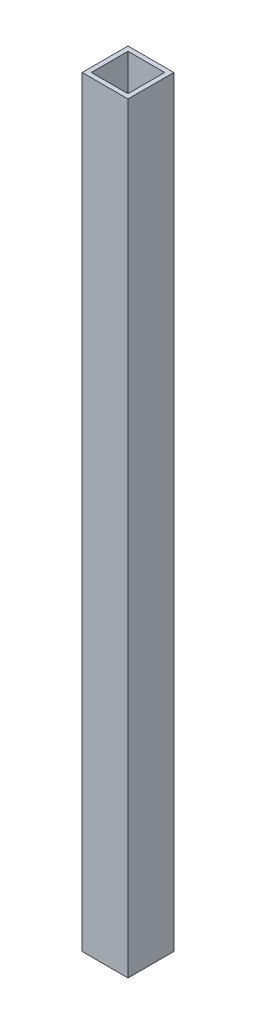
ISO-10303-21;
HEADER;
FILE_DESCRIPTION(('STEP AP214'),'2;1');
FILE_NAME('part.step','',(''),(''),'','','');
FILE_SCHEMA(('AUTOMOTIVE_DESIGN { 1 0 10303 214 1 1 1 1 }'));
ENDSEC;
DATA;
#1=APPLICATION_CONTEXT('core data for automotive mechanical design processes');
#2=APPLICATION_PROTOCOL_DEFINITION('international standard','automotive_design',2000,#1);
#3=PRODUCT_CONTEXT('',#1,'mechanical');
#4=PRODUCT('Part','Part','',(#3));
#5=PRODUCT_RELATED_PRODUCT_CATEGORY('part','',(#4));
#6=PRODUCT_DEFINITION_FORMATION('','',#4);
#7=PRODUCT_DEFINITION_CONTEXT('part definition',#1,'design');
#8=PRODUCT_DEFINITION('design','',#6,#7);
#9=PRODUCT_DEFINITION_SHAPE('','',#8);
#10=(LENGTH_UNIT() NAMED_UNIT(*) SI_UNIT(.MILLI.,.METRE.));
#11=(NAMED_UNIT(*) PLANE_ANGLE_UNIT() SI_UNIT($,.RADIAN.));
#12=(NAMED_UNIT(*) SI_UNIT($,.STERADIAN.) SOLID_ANGLE_UNIT());
#13=UNCERTAINTY_MEASURE_WITH_UNIT(LENGTH_MEASURE(1.E-05),#10,'distance_accuracy_value','');
#14=(GEOMETRIC_REPRESENTATION_CONTEXT(3) GLOBAL_UNCERTAINTY_ASSIGNED_CONTEXT((#13)) GLOBAL_UNIT_ASSIGNED_CONTEXT((#10,
#11,#12)) REPRESENTATION_CONTEXT('',''));
#15=CARTESIAN_POINT('',(0.,0.,0.));
#16=DIRECTION('',(0.,0.,1.));
#17=DIRECTION('',(1.,0.,0.));
#18=AXIS2_PLACEMENT_3D('',#15,#16,#17);
#19=CARTESIAN_POINT('',(0.,166.,0.));
#20=DIRECTION('',(0.,1.,0.));
#21=DIRECTION('',(0.,0.,1.));
#22=AXIS2_PLACEMENT_3D('',#19,#20,#21);
#23=PLANE('',#22);
#24=DIRECTION('',(0.,0.,-1.));
#25=VECTOR('',#24,1.);
#26=CARTESIAN_POINT('',(5.,166.,-5.));
#27=LINE('',#26,#25);
#28=CARTESIAN_POINT('',(5.,166.,5.));
#29=VERTEX_POINT('',#28);
#30=CARTESIAN_POINT('',(5.,166.,-5.));
#31=VERTEX_POINT('',#30);
#32=EDGE_CURVE('E157',#29,#31,#27,.T.);
#33=ORIENTED_EDGE('',*,*,#32,.T.);
#34=DIRECTION('',(-1.,0.,0.));
#35=VECTOR('',#34,1.);
#36=CARTESIAN_POINT('',(-5.,166.,-5.));
#37=LINE('',#36,#35);
#38=CARTESIAN_POINT('',(-5.,166.,-5.));
#39=VERTEX_POINT('',#38);
#40=EDGE_CURVE('E162',#31,#39,#37,.T.);
#41=ORIENTED_EDGE('',*,*,#40,.T.);
#42=DIRECTION('',(0.,0.,1.));
#43=VECTOR('',#42,1.);
#44=CARTESIAN_POINT('',(-5.,166.,-5.));
#45=LINE('',#44,#43);
#46=CARTESIAN_POINT('',(-5.,166.,5.));
#47=VERTEX_POINT('',#46);
#48=EDGE_CURVE('E170',#39,#47,#45,.T.);
#49=ORIENTED_EDGE('',*,*,#48,.T.);
#50=DIRECTION('',(1.,0.,0.));
#51=VECTOR('',#50,1.);
#52=CARTESIAN_POINT('',(-5.,166.,5.));
#53=LINE('',#52,#51);
#54=EDGE_CURVE('E168',#47,#29,#53,.T.);
#55=ORIENTED_EDGE('',*,*,#54,.T.);
#56=EDGE_LOOP('',(#33,#41,#49,#55));
#57=FACE_BOUND('',#56,.T.);
#58=DIRECTION('',(-1.,0.,0.));
#59=VECTOR('',#58,1.);
#60=CARTESIAN_POINT('',(-4.,166.,-4.));
#61=LINE('',#60,#59);
#62=CARTESIAN_POINT('',(4.,166.,-4.));
#63=VERTEX_POINT('',#62);
#64=CARTESIAN_POINT('',(-4.,166.,-4.));
#65=VERTEX_POINT('',#64);
#66=EDGE_CURVE('E116',#63,#65,#61,.T.);
#67=ORIENTED_EDGE('',*,*,#66,.F.);
#68=DIRECTION('',(0.,0.,-1.));
#69=VECTOR('',#68,1.);
#70=CARTESIAN_POINT('',(4.,166.,4.));
#71=LINE('',#70,#69);
#72=CARTESIAN_POINT('',(4.,166.,4.));
#73=VERTEX_POINT('',#72);
#74=EDGE_CURVE('E112',#73,#63,#71,.T.);
#75=ORIENTED_EDGE('',*,*,#74,.F.);
#76=DIRECTION('',(1.,0.,0.));
#77=VECTOR('',#76,1.);
#78=CARTESIAN_POINT('',(-4.,166.,4.));
#79=LINE('',#78,#77);
#80=CARTESIAN_POINT('',(-4.,166.,4.));
#81=VERTEX_POINT('',#80);
#82=EDGE_CURVE('E137',#81,#73,#79,.T.);
#83=ORIENTED_EDGE('',*,*,#82,.F.);
#84=DIRECTION('',(0.,0.,1.));
#85=VECTOR('',#84,1.);
#86=CARTESIAN_POINT('',(-4.,166.,4.));
#87=LINE('',#86,#85);
#88=EDGE_CURVE('E132',#65,#81,#87,.T.);
#89=ORIENTED_EDGE('',*,*,#88,.F.);
#90=EDGE_LOOP('',(#67,#75,#83,#89));
#91=FACE_BOUND('',#90,.T.);
#92=ADVANCED_FACE('F44',(#57,#91),#23,.T.);
#93=CARTESIAN_POINT('',(0.,0.,0.));
#94=DIRECTION('',(0.,1.,0.));
#95=DIRECTION('',(0.,0.,1.));
#96=AXIS2_PLACEMENT_3D('',#93,#94,#95);
#97=PLANE('',#96);
#98=DIRECTION('',(0.,0.,-1.));
#99=VECTOR('',#98,1.);
#100=CARTESIAN_POINT('',(5.,0.,-5.));
#101=LINE('',#100,#99);
#102=CARTESIAN_POINT('',(5.,0.,5.));
#103=VERTEX_POINT('',#102);
#104=CARTESIAN_POINT('',(5.,0.,-5.));
#105=VERTEX_POINT('',#104);
#106=EDGE_CURVE('E129',#103,#105,#101,.T.);
#107=ORIENTED_EDGE('',*,*,#106,.F.);
#108=DIRECTION('',(1.,0.,0.));
#109=VECTOR('',#108,1.);
#110=CARTESIAN_POINT('',(-5.,0.,5.));
#111=LINE('',#110,#109);
#112=CARTESIAN_POINT('',(-5.,0.,5.));
#113=VERTEX_POINT('',#112);
#114=EDGE_CURVE('E163',#113,#103,#111,.T.);
#115=ORIENTED_EDGE('',*,*,#114,.F.);
#116=DIRECTION('',(0.,0.,1.));
#117=VECTOR('',#116,1.);
#118=CARTESIAN_POINT('',(-5.,0.,-5.));
#119=LINE('',#118,#117);
#120=CARTESIAN_POINT('',(-5.,0.,-5.));
#121=VERTEX_POINT('',#120);
#122=EDGE_CURVE('E180',#121,#113,#119,.T.);
#123=ORIENTED_EDGE('',*,*,#122,.F.);
#124=DIRECTION('',(-1.,0.,0.));
#125=VECTOR('',#124,1.);
#126=CARTESIAN_POINT('',(-5.,0.,-5.));
#127=LINE('',#126,#125);
#128=EDGE_CURVE('E177',#105,#121,#127,.T.);
#129=ORIENTED_EDGE('',*,*,#128,.F.);
#130=EDGE_LOOP('',(#107,#115,#123,#129));
#131=FACE_BOUND('',#130,.T.);
#132=DIRECTION('',(0.,0.,-1.));
#133=VECTOR('',#132,1.);
#134=CARTESIAN_POINT('',(4.,0.,4.));
#135=LINE('',#134,#133);
#136=CARTESIAN_POINT('',(4.,0.,4.));
#137=VERTEX_POINT('',#136);
#138=CARTESIAN_POINT('',(4.,0.,-4.));
#139=VERTEX_POINT('',#138);
#140=EDGE_CURVE('E68',#137,#139,#135,.T.);
#141=ORIENTED_EDGE('',*,*,#140,.T.);
#142=DIRECTION('',(-1.,0.,0.));
#143=VECTOR('',#142,1.);
#144=CARTESIAN_POINT('',(-4.,0.,-4.));
#145=LINE('',#144,#143);
#146=CARTESIAN_POINT('',(-4.,0.,-4.));
#147=VERTEX_POINT('',#146);
#148=EDGE_CURVE('E130',#139,#147,#145,.T.);
#149=ORIENTED_EDGE('',*,*,#148,.T.);
#150=DIRECTION('',(0.,0.,1.));
#151=VECTOR('',#150,1.);
#152=CARTESIAN_POINT('',(-4.,0.,4.));
#153=LINE('',#152,#151);
#154=CARTESIAN_POINT('',(-4.,0.,4.));
#155=VERTEX_POINT('',#154);
#156=EDGE_CURVE('E148',#147,#155,#153,.T.);
#157=ORIENTED_EDGE('',*,*,#156,.T.);
#158=DIRECTION('',(1.,0.,0.));
#159=VECTOR('',#158,1.);
#160=CARTESIAN_POINT('',(-4.,0.,4.));
#161=LINE('',#160,#159);
#162=EDGE_CURVE('E121',#155,#137,#161,.T.);
#163=ORIENTED_EDGE('',*,*,#162,.T.);
#164=EDGE_LOOP('',(#141,#149,#157,#163));
#165=FACE_BOUND('',#164,.T.);
#166=ADVANCED_FACE('F201',(#131,#165),#97,.F.);
#167=CARTESIAN_POINT('',(5.,166.,-5.));
#168=DIRECTION('',(-1.,0.,0.));
#169=DIRECTION('',(0.,0.,1.));
#170=AXIS2_PLACEMENT_3D('',#167,#168,#169);
#171=PLANE('',#170);
#172=ORIENTED_EDGE('',*,*,#106,.T.);
#173=DIRECTION('',(0.,-1.,0.));
#174=VECTOR('',#173,1.);
#175=CARTESIAN_POINT('',(5.,166.,-5.));
#176=LINE('',#175,#174);
#177=EDGE_CURVE('E11',#31,#105,#176,.T.);
#178=ORIENTED_EDGE('',*,*,#177,.F.);
#179=ORIENTED_EDGE('',*,*,#32,.F.);
#180=DIRECTION('',(0.,-1.,0.));
#181=VECTOR('',#180,1.);
#182=CARTESIAN_POINT('',(5.,166.,5.));
#183=LINE('',#182,#181);
#184=EDGE_CURVE('E172',#29,#103,#183,.T.);
#185=ORIENTED_EDGE('',*,*,#184,.T.);
#186=EDGE_LOOP('',(#172,#178,#179,#185));
#187=FACE_BOUND('',#186,.T.);
#188=ADVANCED_FACE('F50',(#187),#171,.F.);
#189=CARTESIAN_POINT('',(-5.,166.,-5.));
#190=DIRECTION('',(0.,0.,1.));
#191=DIRECTION('',(1.,0.,0.));
#192=AXIS2_PLACEMENT_3D('',#189,#190,#191);
#193=PLANE('',#192);
#194=ORIENTED_EDGE('',*,*,#128,.T.);
#195=DIRECTION('',(0.,-1.,0.));
#196=VECTOR('',#195,1.);
#197=CARTESIAN_POINT('',(-5.,166.,-5.));
#198=LINE('',#197,#196);
#199=EDGE_CURVE('E53',#39,#121,#198,.T.);
#200=ORIENTED_EDGE('',*,*,#199,.F.);
#201=ORIENTED_EDGE('',*,*,#40,.F.);
#202=ORIENTED_EDGE('',*,*,#177,.T.);
#203=EDGE_LOOP('',(#194,#200,#201,#202));
#204=FACE_BOUND('',#203,.T.);
#205=ADVANCED_FACE('F213',(#204),#193,.F.);
#206=CARTESIAN_POINT('',(-5.,166.,-5.));
#207=DIRECTION('',(1.,0.,0.));
#208=DIRECTION('',(0.,0.,-1.));
#209=AXIS2_PLACEMENT_3D('',#206,#207,#208);
#210=PLANE('',#209);
#211=ORIENTED_EDGE('',*,*,#122,.T.);
#212=DIRECTION('',(0.,-1.,0.));
#213=VECTOR('',#212,1.);
#214=CARTESIAN_POINT('',(-5.,166.,5.));
#215=LINE('',#214,#213);
#216=EDGE_CURVE('E187',#47,#113,#215,.T.);
#217=ORIENTED_EDGE('',*,*,#216,.F.);
#218=ORIENTED_EDGE('',*,*,#48,.F.);
#219=ORIENTED_EDGE('',*,*,#199,.T.);
#220=EDGE_LOOP('',(#211,#217,#218,#219));
#221=FACE_BOUND('',#220,.T.);
#222=ADVANCED_FACE('F197',(#221),#210,.F.);
#223=CARTESIAN_POINT('',(-5.,166.,5.));
#224=DIRECTION('',(0.,0.,-1.));
#225=DIRECTION('',(-1.,0.,0.));
#226=AXIS2_PLACEMENT_3D('',#223,#224,#225);
#227=PLANE('',#226);
#228=ORIENTED_EDGE('',*,*,#114,.T.);
#229=ORIENTED_EDGE('',*,*,#184,.F.);
#230=ORIENTED_EDGE('',*,*,#54,.F.);
#231=ORIENTED_EDGE('',*,*,#216,.T.);
#232=EDGE_LOOP('',(#228,#229,#230,#231));
#233=FACE_BOUND('',#232,.T.);
#234=ADVANCED_FACE('F210',(#233),#227,.F.);
#235=CARTESIAN_POINT('',(4.,166.,4.));
#236=DIRECTION('',(-1.,0.,0.));
#237=DIRECTION('',(0.,0.,1.));
#238=AXIS2_PLACEMENT_3D('',#235,#236,#237);
#239=PLANE('',#238);
#240=ORIENTED_EDGE('',*,*,#140,.F.);
#241=DIRECTION('',(0.,-1.,0.));
#242=VECTOR('',#241,1.);
#243=CARTESIAN_POINT('',(4.,166.,4.));
#244=LINE('',#243,#242);
#245=EDGE_CURVE('E113',#73,#137,#244,.T.);
#246=ORIENTED_EDGE('',*,*,#245,.F.);
#247=ORIENTED_EDGE('',*,*,#74,.T.);
#248=DIRECTION('',(0.,-1.,0.));
#249=VECTOR('',#248,1.);
#250=CARTESIAN_POINT('',(4.,166.,-4.));
#251=LINE('',#250,#249);
#252=EDGE_CURVE('E111',#63,#139,#251,.T.);
#253=ORIENTED_EDGE('',*,*,#252,.T.);
#254=EDGE_LOOP('',(#240,#246,#247,#253));
#255=FACE_BOUND('',#254,.T.);
#256=ADVANCED_FACE('F114',(#255),#239,.T.);
#257=CARTESIAN_POINT('',(-4.,166.,-4.));
#258=DIRECTION('',(0.,0.,1.));
#259=DIRECTION('',(1.,0.,0.));
#260=AXIS2_PLACEMENT_3D('',#257,#258,#259);
#261=PLANE('',#260);
#262=ORIENTED_EDGE('',*,*,#148,.F.);
#263=ORIENTED_EDGE('',*,*,#252,.F.);
#264=ORIENTED_EDGE('',*,*,#66,.T.);
#265=DIRECTION('',(0.,-1.,0.));
#266=VECTOR('',#265,1.);
#267=CARTESIAN_POINT('',(-4.,166.,-4.));
#268=LINE('',#267,#266);
#269=EDGE_CURVE('E128',#65,#147,#268,.T.);
#270=ORIENTED_EDGE('',*,*,#269,.T.);
#271=EDGE_LOOP('',(#262,#263,#264,#270));
#272=FACE_BOUND('',#271,.T.);
#273=ADVANCED_FACE('F123',(#272),#261,.T.);
#274=CARTESIAN_POINT('',(-4.,166.,4.));
#275=DIRECTION('',(1.,0.,0.));
#276=DIRECTION('',(0.,0.,-1.));
#277=AXIS2_PLACEMENT_3D('',#274,#275,#276);
#278=PLANE('',#277);
#279=ORIENTED_EDGE('',*,*,#156,.F.);
#280=ORIENTED_EDGE('',*,*,#269,.F.);
#281=ORIENTED_EDGE('',*,*,#88,.T.);
#282=DIRECTION('',(0.,-1.,0.));
#283=VECTOR('',#282,1.);
#284=CARTESIAN_POINT('',(-4.,166.,4.));
#285=LINE('',#284,#283);
#286=EDGE_CURVE('E63',#81,#155,#285,.T.);
#287=ORIENTED_EDGE('',*,*,#286,.T.);
#288=EDGE_LOOP('',(#279,#280,#281,#287));
#289=FACE_BOUND('',#288,.T.);
#290=ADVANCED_FACE('F237',(#289),#278,.T.);
#291=CARTESIAN_POINT('',(-4.,166.,4.));
#292=DIRECTION('',(0.,0.,-1.));
#293=DIRECTION('',(-1.,0.,0.));
#294=AXIS2_PLACEMENT_3D('',#291,#292,#293);
#295=PLANE('',#294);
#296=ORIENTED_EDGE('',*,*,#162,.F.);
#297=ORIENTED_EDGE('',*,*,#286,.F.);
#298=ORIENTED_EDGE('',*,*,#82,.T.);
#299=ORIENTED_EDGE('',*,*,#245,.T.);
#300=EDGE_LOOP('',(#296,#297,#298,#299));
#301=FACE_BOUND('',#300,.T.);
#302=ADVANCED_FACE('F238',(#301),#295,.T.);
#303=CLOSED_SHELL('',(#92,#166,#188,#205,#222,#234,#256,#273,#290,#302));
#304=MANIFOLD_SOLID_BREP('B2',#303);
#305=ADVANCED_BREP_SHAPE_REPRESENTATION('',(#18,#304),#14);
#306=SHAPE_DEFINITION_REPRESENTATION(#9,#305);
ENDSEC;
END-ISO-10303-21;
